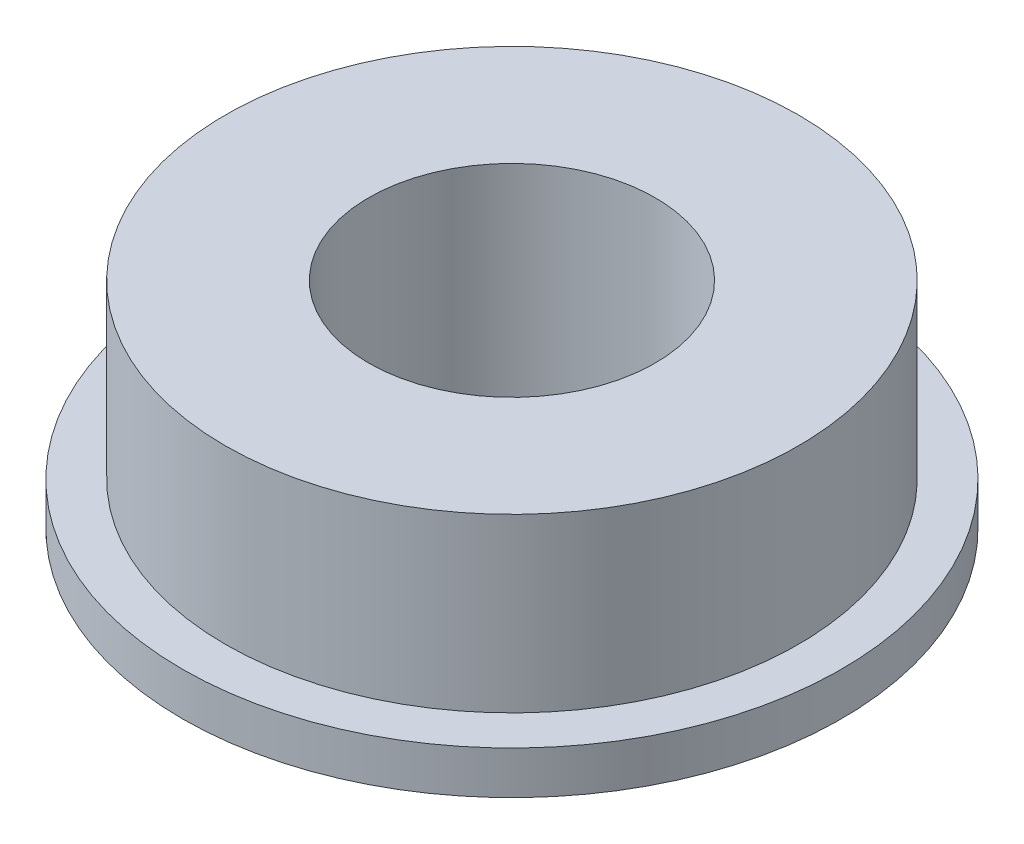
ISO-10303-21;
HEADER;
FILE_DESCRIPTION(('STEP AP214'),'2;1');
FILE_NAME('part.step','',(''),(''),'','','');
FILE_SCHEMA(('AUTOMOTIVE_DESIGN { 1 0 10303 214 1 1 1 1 }'));
ENDSEC;
DATA;
#1=APPLICATION_CONTEXT('core data for automotive mechanical design processes');
#2=APPLICATION_PROTOCOL_DEFINITION('international standard','automotive_design',2000,#1);
#3=PRODUCT_CONTEXT('',#1,'mechanical');
#4=PRODUCT('Part','Part','',(#3));
#5=PRODUCT_RELATED_PRODUCT_CATEGORY('part','',(#4));
#6=PRODUCT_DEFINITION_FORMATION('','',#4);
#7=PRODUCT_DEFINITION_CONTEXT('part definition',#1,'design');
#8=PRODUCT_DEFINITION('design','',#6,#7);
#9=PRODUCT_DEFINITION_SHAPE('','',#8);
#10=(LENGTH_UNIT() NAMED_UNIT(*) SI_UNIT(.MILLI.,.METRE.));
#11=(NAMED_UNIT(*) PLANE_ANGLE_UNIT() SI_UNIT($,.RADIAN.));
#12=(NAMED_UNIT(*) SI_UNIT($,.STERADIAN.) SOLID_ANGLE_UNIT());
#13=UNCERTAINTY_MEASURE_WITH_UNIT(LENGTH_MEASURE(1.E-05),#10,'distance_accuracy_value','');
#14=(GEOMETRIC_REPRESENTATION_CONTEXT(3) GLOBAL_UNCERTAINTY_ASSIGNED_CONTEXT((#13)) GLOBAL_UNIT_ASSIGNED_CONTEXT((#10,
#11,#12)) REPRESENTATION_CONTEXT('',''));
#15=CARTESIAN_POINT('',(0.,0.,0.));
#16=DIRECTION('',(0.,0.,1.));
#17=DIRECTION('',(1.,0.,0.));
#18=AXIS2_PLACEMENT_3D('',#15,#16,#17);
#19=CARTESIAN_POINT('',(0.,0.599999999999989,0.));
#20=DIRECTION('',(0.,-1.,0.));
#21=DIRECTION('',(0.,0.,-1.));
#22=AXIS2_PLACEMENT_3D('',#19,#20,#21);
#23=CYLINDRICAL_SURFACE('',#22,4.6);
#24=CARTESIAN_POINT('',(0.,0.599999999999989,0.));
#25=DIRECTION('',(0.,1.,0.));
#26=DIRECTION('',(0.,0.,1.));
#27=AXIS2_PLACEMENT_3D('',#24,#25,#26);
#28=CIRCLE('',#27,4.6);
#29=CARTESIAN_POINT('',(0.,0.599999999999989,4.6));
#30=VERTEX_POINT('',#29);
#31=EDGE_CURVE('E10',#30,#30,#28,.T.);
#32=ORIENTED_EDGE('',*,*,#31,.F.);
#33=EDGE_LOOP('',(#32));
#34=FACE_BOUND('',#33,.T.);
#35=CARTESIAN_POINT('',(0.,0.,0.));
#36=DIRECTION('',(0.,1.,0.));
#37=DIRECTION('',(0.,0.,1.));
#38=AXIS2_PLACEMENT_3D('',#35,#36,#37);
#39=CIRCLE('',#38,4.6);
#40=CARTESIAN_POINT('',(0.,0.,4.6));
#41=VERTEX_POINT('',#40);
#42=EDGE_CURVE('E35',#41,#41,#39,.T.);
#43=ORIENTED_EDGE('',*,*,#42,.T.);
#44=EDGE_LOOP('',(#43));
#45=FACE_BOUND('',#44,.T.);
#46=ADVANCED_FACE('F32',(#34,#45),#23,.T.);
#47=CARTESIAN_POINT('',(0.,0.599999999999989,0.));
#48=DIRECTION('',(0.,1.,0.));
#49=DIRECTION('',(0.,0.,1.));
#50=AXIS2_PLACEMENT_3D('',#47,#48,#49);
#51=PLANE('',#50);
#52=CARTESIAN_POINT('',(0.,0.599999999999989,0.));
#53=DIRECTION('',(0.,1.,0.));
#54=DIRECTION('',(0.,0.,1.));
#55=AXIS2_PLACEMENT_3D('',#52,#53,#54);
#56=CIRCLE('',#55,4.);
#57=CARTESIAN_POINT('',(0.,0.599999999999989,4.));
#58=VERTEX_POINT('',#57);
#59=EDGE_CURVE('E42',#58,#58,#56,.F.);
#60=ORIENTED_EDGE('',*,*,#59,.T.);
#61=EDGE_LOOP('',(#60));
#62=FACE_BOUND('',#61,.T.);
#63=ORIENTED_EDGE('',*,*,#31,.T.);
#64=EDGE_LOOP('',(#63));
#65=FACE_BOUND('',#64,.T.);
#66=ADVANCED_FACE('F78',(#62,#65),#51,.T.);
#67=CARTESIAN_POINT('',(0.,0.,0.));
#68=DIRECTION('',(0.,1.,0.));
#69=DIRECTION('',(0.,0.,1.));
#70=AXIS2_PLACEMENT_3D('',#67,#68,#69);
#71=PLANE('',#70);
#72=CARTESIAN_POINT('',(0.,0.,0.));
#73=DIRECTION('',(0.,1.,0.));
#74=DIRECTION('',(0.,0.,1.));
#75=AXIS2_PLACEMENT_3D('',#72,#73,#74);
#76=CIRCLE('',#75,2.);
#77=CARTESIAN_POINT('',(0.,0.,2.));
#78=VERTEX_POINT('',#77);
#79=EDGE_CURVE('E49',#78,#78,#76,.T.);
#80=ORIENTED_EDGE('',*,*,#79,.T.);
#81=EDGE_LOOP('',(#80));
#82=FACE_BOUND('',#81,.T.);
#83=ORIENTED_EDGE('',*,*,#42,.F.);
#84=EDGE_LOOP('',(#83));
#85=FACE_BOUND('',#84,.T.);
#86=ADVANCED_FACE('F56',(#82,#85),#71,.F.);
#87=CARTESIAN_POINT('',(0.,3.,0.));
#88=DIRECTION('',(0.,-1.,0.));
#89=DIRECTION('',(0.,0.,-1.));
#90=AXIS2_PLACEMENT_3D('',#87,#88,#89);
#91=CYLINDRICAL_SURFACE('',#90,4.);
#92=ORIENTED_EDGE('',*,*,#59,.F.);
#93=EDGE_LOOP('',(#92));
#94=FACE_BOUND('',#93,.T.);
#95=CARTESIAN_POINT('',(0.,3.,0.));
#96=DIRECTION('',(0.,1.,0.));
#97=DIRECTION('',(0.,0.,1.));
#98=AXIS2_PLACEMENT_3D('',#95,#96,#97);
#99=CIRCLE('',#98,4.);
#100=CARTESIAN_POINT('',(0.,3.,4.));
#101=VERTEX_POINT('',#100);
#102=EDGE_CURVE('E46',#101,#101,#99,.T.);
#103=ORIENTED_EDGE('',*,*,#102,.F.);
#104=EDGE_LOOP('',(#103));
#105=FACE_BOUND('',#104,.T.);
#106=ADVANCED_FACE('F68',(#94,#105),#91,.T.);
#107=CARTESIAN_POINT('',(0.,3.,0.));
#108=DIRECTION('',(0.,1.,0.));
#109=DIRECTION('',(0.,0.,1.));
#110=AXIS2_PLACEMENT_3D('',#107,#108,#109);
#111=PLANE('',#110);
#112=CARTESIAN_POINT('',(0.,3.,0.));
#113=DIRECTION('',(0.,1.,0.));
#114=DIRECTION('',(0.,0.,1.));
#115=AXIS2_PLACEMENT_3D('',#112,#113,#114);
#116=CIRCLE('',#115,2.);
#117=CARTESIAN_POINT('',(0.,3.,2.));
#118=VERTEX_POINT('',#117);
#119=EDGE_CURVE('E50',#118,#118,#116,.T.);
#120=ORIENTED_EDGE('',*,*,#119,.F.);
#121=EDGE_LOOP('',(#120));
#122=FACE_BOUND('',#121,.T.);
#123=ORIENTED_EDGE('',*,*,#102,.T.);
#124=EDGE_LOOP('',(#123));
#125=FACE_BOUND('',#124,.T.);
#126=ADVANCED_FACE('F62',(#122,#125),#111,.T.);
#127=CARTESIAN_POINT('',(0.,0.,0.));
#128=DIRECTION('',(0.,1.,0.));
#129=DIRECTION('',(0.,0.,1.));
#130=AXIS2_PLACEMENT_3D('',#127,#128,#129);
#131=CYLINDRICAL_SURFACE('',#130,2.);
#132=ORIENTED_EDGE('',*,*,#79,.F.);
#133=EDGE_LOOP('',(#132));
#134=FACE_BOUND('',#133,.T.);
#135=ORIENTED_EDGE('',*,*,#119,.T.);
#136=EDGE_LOOP('',(#135));
#137=FACE_BOUND('',#136,.T.);
#138=ADVANCED_FACE('F59',(#134,#137),#131,.F.);
#139=CLOSED_SHELL('',(#46,#66,#86,#106,#126,#138));
#140=MANIFOLD_SOLID_BREP('B2',#139);
#141=ADVANCED_BREP_SHAPE_REPRESENTATION('',(#18,#140),#14);
#142=SHAPE_DEFINITION_REPRESENTATION(#9,#141);
ENDSEC;
END-ISO-10303-21;
